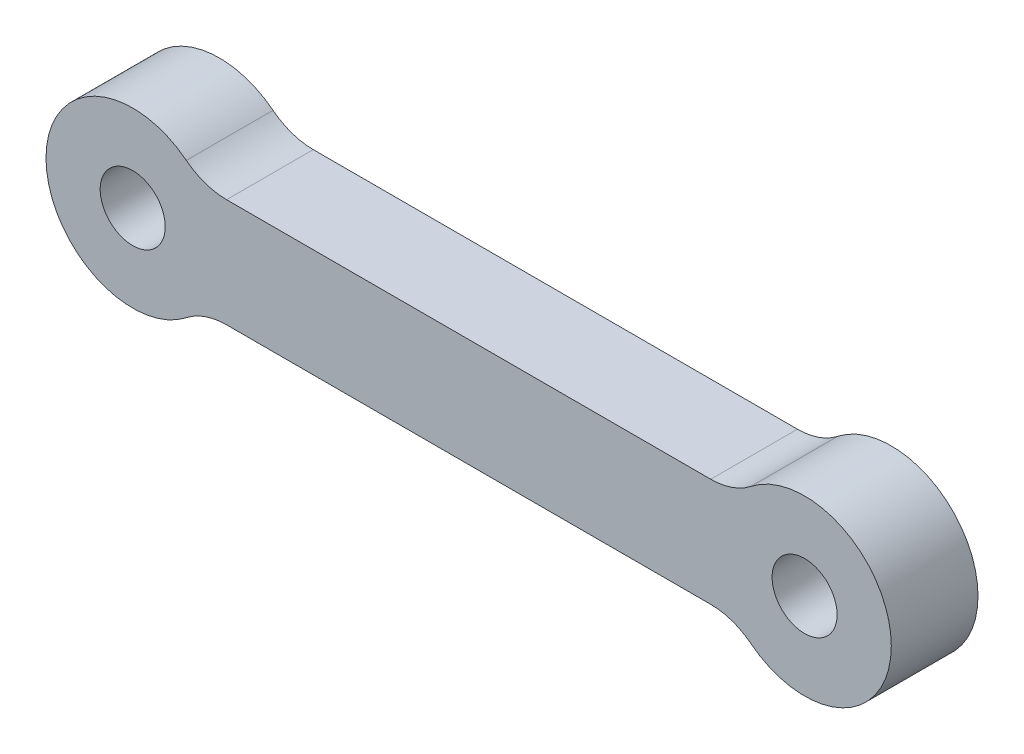
ISO-10303-21;
HEADER;
FILE_DESCRIPTION(('STEP AP214'),'2;1');
FILE_NAME('part.step','',(''),(''),'','','');
FILE_SCHEMA(('AUTOMOTIVE_DESIGN { 1 0 10303 214 1 1 1 1 }'));
ENDSEC;
DATA;
#1=APPLICATION_CONTEXT('core data for automotive mechanical design processes');
#2=APPLICATION_PROTOCOL_DEFINITION('international standard','automotive_design',2000,#1);
#3=PRODUCT_CONTEXT('',#1,'mechanical');
#4=PRODUCT('Part','Part','',(#3));
#5=PRODUCT_RELATED_PRODUCT_CATEGORY('part','',(#4));
#6=PRODUCT_DEFINITION_FORMATION('','',#4);
#7=PRODUCT_DEFINITION_CONTEXT('part definition',#1,'design');
#8=PRODUCT_DEFINITION('design','',#6,#7);
#9=PRODUCT_DEFINITION_SHAPE('','',#8);
#10=(LENGTH_UNIT() NAMED_UNIT(*) SI_UNIT(.MILLI.,.METRE.));
#11=(NAMED_UNIT(*) PLANE_ANGLE_UNIT() SI_UNIT($,.RADIAN.));
#12=(NAMED_UNIT(*) SI_UNIT($,.STERADIAN.) SOLID_ANGLE_UNIT());
#13=UNCERTAINTY_MEASURE_WITH_UNIT(LENGTH_MEASURE(1.E-05),#10,'distance_accuracy_value','');
#14=(GEOMETRIC_REPRESENTATION_CONTEXT(3) GLOBAL_UNCERTAINTY_ASSIGNED_CONTEXT((#13)) GLOBAL_UNIT_ASSIGNED_CONTEXT((#10,
#11,#12)) REPRESENTATION_CONTEXT('',''));
#15=CARTESIAN_POINT('',(0.,0.,0.));
#16=DIRECTION('',(0.,0.,1.));
#17=DIRECTION('',(1.,0.,0.));
#18=AXIS2_PLACEMENT_3D('',#15,#16,#17);
#19=CARTESIAN_POINT('',(11.1698729810778,5.5,4.));
#20=DIRECTION('',(0.,0.,-1.));
#21=DIRECTION('',(-1.,0.,0.));
#22=AXIS2_PLACEMENT_3D('',#19,#20,#21);
#23=CYLINDRICAL_SURFACE('',#22,3.);
#24=CARTESIAN_POINT('',(11.1698729810778,5.5,0.));
#25=DIRECTION('',(0.,0.,1.));
#26=DIRECTION('',(1.,0.,0.));
#27=AXIS2_PLACEMENT_3D('',#24,#25,#26);
#28=CIRCLE('',#27,3.);
#29=CARTESIAN_POINT('',(11.1698729810778,2.5,0.));
#30=VERTEX_POINT('',#29);
#31=CARTESIAN_POINT('',(13.025641703473,3.14285714285714,0.));
#32=VERTEX_POINT('',#31);
#33=EDGE_CURVE('E141',#30,#32,#28,.T.);
#34=ORIENTED_EDGE('',*,*,#33,.F.);
#35=DIRECTION('',(0.,0.,-1.));
#36=VECTOR('',#35,1.);
#37=CARTESIAN_POINT('',(11.1698729810778,2.5,4.));
#38=LINE('',#37,#36);
#39=CARTESIAN_POINT('',(11.1698729810778,2.5,4.));
#40=VERTEX_POINT('',#39);
#41=EDGE_CURVE('E11',#40,#30,#38,.T.);
#42=ORIENTED_EDGE('',*,*,#41,.F.);
#43=CARTESIAN_POINT('',(11.1698729810778,5.5,4.));
#44=DIRECTION('',(0.,0.,1.));
#45=DIRECTION('',(1.,0.,0.));
#46=AXIS2_PLACEMENT_3D('',#43,#44,#45);
#47=CIRCLE('',#46,3.);
#48=CARTESIAN_POINT('',(13.025641703473,3.14285714285714,4.));
#49=VERTEX_POINT('',#48);
#50=EDGE_CURVE('E163',#40,#49,#47,.T.);
#51=ORIENTED_EDGE('',*,*,#50,.T.);
#52=DIRECTION('',(0.,0.,-1.));
#53=VECTOR('',#52,1.);
#54=CARTESIAN_POINT('',(13.025641703473,3.14285714285714,4.));
#55=LINE('',#54,#53);
#56=EDGE_CURVE('E60',#49,#32,#55,.T.);
#57=ORIENTED_EDGE('',*,*,#56,.T.);
#58=EDGE_LOOP('',(#34,#42,#51,#57));
#59=FACE_BOUND('',#58,.T.);
#60=ADVANCED_FACE('F41',(#59),#23,.F.);
#61=CARTESIAN_POINT('',(0.,2.5,4.));
#62=DIRECTION('',(0.,1.,0.));
#63=DIRECTION('',(0.,0.,1.));
#64=AXIS2_PLACEMENT_3D('',#61,#62,#63);
#65=PLANE('',#64);
#66=DIRECTION('',(1.,0.,0.));
#67=VECTOR('',#66,1.);
#68=CARTESIAN_POINT('',(0.,2.5,0.));
#69=LINE('',#68,#67);
#70=CARTESIAN_POINT('',(-11.1698729810778,2.5,0.));
#71=VERTEX_POINT('',#70);
#72=EDGE_CURVE('E142',#71,#30,#69,.T.);
#73=ORIENTED_EDGE('',*,*,#72,.F.);
#74=DIRECTION('',(0.,0.,-1.));
#75=VECTOR('',#74,1.);
#76=CARTESIAN_POINT('',(-11.1698729810778,2.5,4.));
#77=LINE('',#76,#75);
#78=CARTESIAN_POINT('',(-11.1698729810778,2.5,4.));
#79=VERTEX_POINT('',#78);
#80=EDGE_CURVE('E47',#79,#71,#77,.T.);
#81=ORIENTED_EDGE('',*,*,#80,.F.);
#82=DIRECTION('',(1.,0.,0.));
#83=VECTOR('',#82,1.);
#84=CARTESIAN_POINT('',(0.,2.5,4.));
#85=LINE('',#84,#83);
#86=EDGE_CURVE('E188',#79,#40,#85,.T.);
#87=ORIENTED_EDGE('',*,*,#86,.T.);
#88=ORIENTED_EDGE('',*,*,#41,.T.);
#89=EDGE_LOOP('',(#73,#81,#87,#88));
#90=FACE_BOUND('',#89,.T.);
#91=ADVANCED_FACE('F187',(#90),#65,.T.);
#92=CARTESIAN_POINT('',(-11.1698729810778,5.5,4.));
#93=DIRECTION('',(0.,0.,-1.));
#94=DIRECTION('',(-1.,0.,0.));
#95=AXIS2_PLACEMENT_3D('',#92,#93,#94);
#96=CYLINDRICAL_SURFACE('',#95,3.);
#97=CARTESIAN_POINT('',(-11.1698729810778,5.5,0.));
#98=DIRECTION('',(0.,0.,1.));
#99=DIRECTION('',(1.,0.,0.));
#100=AXIS2_PLACEMENT_3D('',#97,#98,#99);
#101=CIRCLE('',#100,3.);
#102=CARTESIAN_POINT('',(-13.025641703473,3.14285714285714,0.));
#103=VERTEX_POINT('',#102);
#104=EDGE_CURVE('E147',#71,#103,#101,.F.);
#105=ORIENTED_EDGE('',*,*,#104,.T.);
#106=DIRECTION('',(0.,0.,-1.));
#107=VECTOR('',#106,1.);
#108=CARTESIAN_POINT('',(-13.025641703473,3.14285714285714,4.));
#109=LINE('',#108,#107);
#110=CARTESIAN_POINT('',(-13.025641703473,3.14285714285714,4.));
#111=VERTEX_POINT('',#110);
#112=EDGE_CURVE('E173',#111,#103,#109,.T.);
#113=ORIENTED_EDGE('',*,*,#112,.F.);
#114=CARTESIAN_POINT('',(-11.1698729810778,5.5,4.));
#115=DIRECTION('',(0.,0.,1.));
#116=DIRECTION('',(1.,0.,0.));
#117=AXIS2_PLACEMENT_3D('',#114,#115,#116);
#118=CIRCLE('',#117,3.);
#119=EDGE_CURVE('E178',#79,#111,#118,.F.);
#120=ORIENTED_EDGE('',*,*,#119,.F.);
#121=ORIENTED_EDGE('',*,*,#80,.T.);
#122=EDGE_LOOP('',(#105,#113,#120,#121));
#123=FACE_BOUND('',#122,.T.);
#124=ADVANCED_FACE('F176',(#123),#96,.F.);
#125=CARTESIAN_POINT('',(-15.5,0.,4.));
#126=DIRECTION('',(0.,0.,-1.));
#127=DIRECTION('',(-1.,0.,0.));
#128=AXIS2_PLACEMENT_3D('',#125,#126,#127);
#129=CYLINDRICAL_SURFACE('',#128,4.);
#130=CARTESIAN_POINT('',(-15.5,0.,0.));
#131=DIRECTION('',(0.,0.,1.));
#132=DIRECTION('',(1.,0.,0.));
#133=AXIS2_PLACEMENT_3D('',#130,#131,#132);
#134=CIRCLE('',#133,4.);
#135=CARTESIAN_POINT('',(-13.025641703473,-3.14285714285714,0.));
#136=VERTEX_POINT('',#135);
#137=EDGE_CURVE('E149',#103,#136,#134,.T.);
#138=ORIENTED_EDGE('',*,*,#137,.T.);
#139=DIRECTION('',(0.,0.,-1.));
#140=VECTOR('',#139,1.);
#141=CARTESIAN_POINT('',(-13.025641703473,-3.14285714285714,4.));
#142=LINE('',#141,#140);
#143=CARTESIAN_POINT('',(-13.025641703473,-3.14285714285714,4.));
#144=VERTEX_POINT('',#143);
#145=EDGE_CURVE('E166',#144,#136,#142,.T.);
#146=ORIENTED_EDGE('',*,*,#145,.F.);
#147=CARTESIAN_POINT('',(-15.5,0.,4.));
#148=DIRECTION('',(0.,0.,1.));
#149=DIRECTION('',(1.,0.,0.));
#150=AXIS2_PLACEMENT_3D('',#147,#148,#149);
#151=CIRCLE('',#150,4.);
#152=EDGE_CURVE('E293',#111,#144,#151,.T.);
#153=ORIENTED_EDGE('',*,*,#152,.F.);
#154=ORIENTED_EDGE('',*,*,#112,.T.);
#155=EDGE_LOOP('',(#138,#146,#153,#154));
#156=FACE_BOUND('',#155,.T.);
#157=ADVANCED_FACE('F213',(#156),#129,.T.);
#158=CARTESIAN_POINT('',(-11.1698729810778,-5.5,4.));
#159=DIRECTION('',(0.,0.,-1.));
#160=DIRECTION('',(-1.,0.,0.));
#161=AXIS2_PLACEMENT_3D('',#158,#159,#160);
#162=CYLINDRICAL_SURFACE('',#161,3.);
#163=CARTESIAN_POINT('',(-11.1698729810778,-5.5,0.));
#164=DIRECTION('',(0.,0.,1.));
#165=DIRECTION('',(1.,0.,0.));
#166=AXIS2_PLACEMENT_3D('',#163,#164,#165);
#167=CIRCLE('',#166,3.);
#168=CARTESIAN_POINT('',(-11.1698729810778,-2.5,0.));
#169=VERTEX_POINT('',#168);
#170=EDGE_CURVE('E148',#136,#169,#167,.F.);
#171=ORIENTED_EDGE('',*,*,#170,.T.);
#172=DIRECTION('',(0.,0.,-1.));
#173=VECTOR('',#172,1.);
#174=CARTESIAN_POINT('',(-11.1698729810778,-2.5,4.));
#175=LINE('',#174,#173);
#176=CARTESIAN_POINT('',(-11.1698729810778,-2.5,4.));
#177=VERTEX_POINT('',#176);
#178=EDGE_CURVE('E130',#177,#169,#175,.T.);
#179=ORIENTED_EDGE('',*,*,#178,.F.);
#180=CARTESIAN_POINT('',(-11.1698729810778,-5.5,4.));
#181=DIRECTION('',(0.,0.,1.));
#182=DIRECTION('',(1.,0.,0.));
#183=AXIS2_PLACEMENT_3D('',#180,#181,#182);
#184=CIRCLE('',#183,3.);
#185=EDGE_CURVE('E113',#144,#177,#184,.F.);
#186=ORIENTED_EDGE('',*,*,#185,.F.);
#187=ORIENTED_EDGE('',*,*,#145,.T.);
#188=EDGE_LOOP('',(#171,#179,#186,#187));
#189=FACE_BOUND('',#188,.T.);
#190=ADVANCED_FACE('F218',(#189),#162,.F.);
#191=CARTESIAN_POINT('',(0.,-2.5,4.));
#192=DIRECTION('',(0.,1.,0.));
#193=DIRECTION('',(0.,0.,1.));
#194=AXIS2_PLACEMENT_3D('',#191,#192,#193);
#195=PLANE('',#194);
#196=DIRECTION('',(1.,0.,0.));
#197=VECTOR('',#196,1.);
#198=CARTESIAN_POINT('',(0.,-2.5,0.));
#199=LINE('',#198,#197);
#200=CARTESIAN_POINT('',(11.1698729810778,-2.5,0.));
#201=VERTEX_POINT('',#200);
#202=EDGE_CURVE('E125',#169,#201,#199,.T.);
#203=ORIENTED_EDGE('',*,*,#202,.T.);
#204=DIRECTION('',(0.,0.,-1.));
#205=VECTOR('',#204,1.);
#206=CARTESIAN_POINT('',(11.1698729810778,-2.5,4.));
#207=LINE('',#206,#205);
#208=CARTESIAN_POINT('',(11.1698729810778,-2.5,4.));
#209=VERTEX_POINT('',#208);
#210=EDGE_CURVE('E123',#209,#201,#207,.T.);
#211=ORIENTED_EDGE('',*,*,#210,.F.);
#212=DIRECTION('',(1.,0.,0.));
#213=VECTOR('',#212,1.);
#214=CARTESIAN_POINT('',(0.,-2.5,4.));
#215=LINE('',#214,#213);
#216=EDGE_CURVE('E107',#177,#209,#215,.T.);
#217=ORIENTED_EDGE('',*,*,#216,.F.);
#218=ORIENTED_EDGE('',*,*,#178,.T.);
#219=EDGE_LOOP('',(#203,#211,#217,#218));
#220=FACE_BOUND('',#219,.T.);
#221=ADVANCED_FACE('F122',(#220),#195,.F.);
#222=CARTESIAN_POINT('',(11.1698729810778,-5.5,4.));
#223=DIRECTION('',(0.,0.,-1.));
#224=DIRECTION('',(-1.,0.,0.));
#225=AXIS2_PLACEMENT_3D('',#222,#223,#224);
#226=CYLINDRICAL_SURFACE('',#225,3.);
#227=CARTESIAN_POINT('',(11.1698729810778,-5.5,0.));
#228=DIRECTION('',(0.,0.,1.));
#229=DIRECTION('',(1.,0.,0.));
#230=AXIS2_PLACEMENT_3D('',#227,#228,#229);
#231=CIRCLE('',#230,3.);
#232=CARTESIAN_POINT('',(13.025641703473,-3.14285714285714,0.));
#233=VERTEX_POINT('',#232);
#234=EDGE_CURVE('E154',#201,#233,#231,.F.);
#235=ORIENTED_EDGE('',*,*,#234,.T.);
#236=DIRECTION('',(0.,0.,-1.));
#237=VECTOR('',#236,1.);
#238=CARTESIAN_POINT('',(13.025641703473,-3.14285714285714,4.));
#239=LINE('',#238,#237);
#240=CARTESIAN_POINT('',(13.025641703473,-3.14285714285714,4.));
#241=VERTEX_POINT('',#240);
#242=EDGE_CURVE('E81',#241,#233,#239,.T.);
#243=ORIENTED_EDGE('',*,*,#242,.F.);
#244=CARTESIAN_POINT('',(11.1698729810778,-5.5,4.));
#245=DIRECTION('',(0.,0.,1.));
#246=DIRECTION('',(1.,0.,0.));
#247=AXIS2_PLACEMENT_3D('',#244,#245,#246);
#248=CIRCLE('',#247,3.);
#249=EDGE_CURVE('E111',#209,#241,#248,.F.);
#250=ORIENTED_EDGE('',*,*,#249,.F.);
#251=ORIENTED_EDGE('',*,*,#210,.T.);
#252=EDGE_LOOP('',(#235,#243,#250,#251));
#253=FACE_BOUND('',#252,.T.);
#254=ADVANCED_FACE('F129',(#253),#226,.F.);
#255=CARTESIAN_POINT('',(15.5,0.,4.));
#256=DIRECTION('',(0.,0.,-1.));
#257=DIRECTION('',(-1.,0.,0.));
#258=AXIS2_PLACEMENT_3D('',#255,#256,#257);
#259=CYLINDRICAL_SURFACE('',#258,1.5);
#260=CARTESIAN_POINT('',(15.5,0.,4.));
#261=DIRECTION('',(0.,0.,1.));
#262=DIRECTION('',(1.,0.,0.));
#263=AXIS2_PLACEMENT_3D('',#260,#261,#262);
#264=CIRCLE('',#263,1.5);
#265=CARTESIAN_POINT('',(17.,0.,4.));
#266=VERTEX_POINT('',#265);
#267=EDGE_CURVE('E135',#266,#266,#264,.F.);
#268=ORIENTED_EDGE('',*,*,#267,.F.);
#269=EDGE_LOOP('',(#268));
#270=FACE_BOUND('',#269,.T.);
#271=CARTESIAN_POINT('',(15.5,0.,0.));
#272=DIRECTION('',(0.,0.,1.));
#273=DIRECTION('',(1.,0.,0.));
#274=AXIS2_PLACEMENT_3D('',#271,#272,#273);
#275=CIRCLE('',#274,1.5);
#276=CARTESIAN_POINT('',(17.,0.,0.));
#277=VERTEX_POINT('',#276);
#278=EDGE_CURVE('E156',#277,#277,#275,.F.);
#279=ORIENTED_EDGE('',*,*,#278,.T.);
#280=EDGE_LOOP('',(#279));
#281=FACE_BOUND('',#280,.T.);
#282=ADVANCED_FACE('F194',(#270,#281),#259,.F.);
#283=CARTESIAN_POINT('',(15.5,0.,4.));
#284=DIRECTION('',(0.,0.,-1.));
#285=DIRECTION('',(-1.,0.,0.));
#286=AXIS2_PLACEMENT_3D('',#283,#284,#285);
#287=CYLINDRICAL_SURFACE('',#286,4.);
#288=CARTESIAN_POINT('',(15.5,0.,0.));
#289=DIRECTION('',(0.,0.,1.));
#290=DIRECTION('',(1.,0.,0.));
#291=AXIS2_PLACEMENT_3D('',#288,#289,#290);
#292=CIRCLE('',#291,4.);
#293=EDGE_CURVE('E155',#32,#233,#292,.F.);
#294=ORIENTED_EDGE('',*,*,#293,.F.);
#295=ORIENTED_EDGE('',*,*,#56,.F.);
#296=CARTESIAN_POINT('',(15.5,0.,4.));
#297=DIRECTION('',(0.,0.,1.));
#298=DIRECTION('',(1.,0.,0.));
#299=AXIS2_PLACEMENT_3D('',#296,#297,#298);
#300=CIRCLE('',#299,4.);
#301=EDGE_CURVE('E127',#49,#241,#300,.F.);
#302=ORIENTED_EDGE('',*,*,#301,.T.);
#303=ORIENTED_EDGE('',*,*,#242,.T.);
#304=EDGE_LOOP('',(#294,#295,#302,#303));
#305=FACE_BOUND('',#304,.T.);
#306=ADVANCED_FACE('F189',(#305),#287,.T.);
#307=CARTESIAN_POINT('',(-15.5,0.,4.));
#308=DIRECTION('',(0.,0.,-1.));
#309=DIRECTION('',(-1.,0.,0.));
#310=AXIS2_PLACEMENT_3D('',#307,#308,#309);
#311=CYLINDRICAL_SURFACE('',#310,1.5);
#312=CARTESIAN_POINT('',(-15.5,0.,4.));
#313=DIRECTION('',(0.,0.,1.));
#314=DIRECTION('',(1.,0.,0.));
#315=AXIS2_PLACEMENT_3D('',#312,#313,#314);
#316=CIRCLE('',#315,1.5);
#317=CARTESIAN_POINT('',(-14.,0.,4.));
#318=VERTEX_POINT('',#317);
#319=EDGE_CURVE('E138',#318,#318,#316,.T.);
#320=ORIENTED_EDGE('',*,*,#319,.T.);
#321=EDGE_LOOP('',(#320));
#322=FACE_BOUND('',#321,.T.);
#323=CARTESIAN_POINT('',(-15.5,0.,0.));
#324=DIRECTION('',(0.,0.,1.));
#325=DIRECTION('',(1.,0.,0.));
#326=AXIS2_PLACEMENT_3D('',#323,#324,#325);
#327=CIRCLE('',#326,1.5);
#328=CARTESIAN_POINT('',(-14.,0.,0.));
#329=VERTEX_POINT('',#328);
#330=EDGE_CURVE('E161',#329,#329,#327,.T.);
#331=ORIENTED_EDGE('',*,*,#330,.F.);
#332=EDGE_LOOP('',(#331));
#333=FACE_BOUND('',#332,.T.);
#334=ADVANCED_FACE('F195',(#322,#333),#311,.F.);
#335=CARTESIAN_POINT('',(0.,0.,4.));
#336=DIRECTION('',(0.,0.,1.));
#337=DIRECTION('',(1.,0.,0.));
#338=AXIS2_PLACEMENT_3D('',#335,#336,#337);
#339=PLANE('',#338);
#340=ORIENTED_EDGE('',*,*,#50,.F.);
#341=ORIENTED_EDGE('',*,*,#86,.F.);
#342=ORIENTED_EDGE('',*,*,#119,.T.);
#343=ORIENTED_EDGE('',*,*,#152,.T.);
#344=ORIENTED_EDGE('',*,*,#185,.T.);
#345=ORIENTED_EDGE('',*,*,#216,.T.);
#346=ORIENTED_EDGE('',*,*,#249,.T.);
#347=ORIENTED_EDGE('',*,*,#301,.F.);
#348=EDGE_LOOP('',(#340,#341,#342,#343,#344,#345,#346,#347));
#349=FACE_BOUND('',#348,.T.);
#350=ORIENTED_EDGE('',*,*,#267,.T.);
#351=EDGE_LOOP('',(#350));
#352=FACE_BOUND('',#351,.T.);
#353=ORIENTED_EDGE('',*,*,#319,.F.);
#354=EDGE_LOOP('',(#353));
#355=FACE_BOUND('',#354,.T.);
#356=ADVANCED_FACE('F108',(#349,#352,#355),#339,.T.);
#357=CARTESIAN_POINT('',(0.,0.,0.));
#358=DIRECTION('',(0.,0.,1.));
#359=DIRECTION('',(1.,0.,0.));
#360=AXIS2_PLACEMENT_3D('',#357,#358,#359);
#361=PLANE('',#360);
#362=ORIENTED_EDGE('',*,*,#33,.T.);
#363=ORIENTED_EDGE('',*,*,#293,.T.);
#364=ORIENTED_EDGE('',*,*,#234,.F.);
#365=ORIENTED_EDGE('',*,*,#202,.F.);
#366=ORIENTED_EDGE('',*,*,#170,.F.);
#367=ORIENTED_EDGE('',*,*,#137,.F.);
#368=ORIENTED_EDGE('',*,*,#104,.F.);
#369=ORIENTED_EDGE('',*,*,#72,.T.);
#370=EDGE_LOOP('',(#362,#363,#364,#365,#366,#367,#368,#369));
#371=FACE_BOUND('',#370,.T.);
#372=ORIENTED_EDGE('',*,*,#278,.F.);
#373=EDGE_LOOP('',(#372));
#374=FACE_BOUND('',#373,.T.);
#375=ORIENTED_EDGE('',*,*,#330,.T.);
#376=EDGE_LOOP('',(#375));
#377=FACE_BOUND('',#376,.T.);
#378=ADVANCED_FACE('F184',(#371,#374,#377),#361,.F.);
#379=CLOSED_SHELL('',(#60,#91,#124,#157,#190,#221,#254,#282,#306,#334,#356,#378));
#380=MANIFOLD_SOLID_BREP('B2',#379);
#381=ADVANCED_BREP_SHAPE_REPRESENTATION('',(#18,#380),#14);
#382=SHAPE_DEFINITION_REPRESENTATION(#9,#381);
ENDSEC;
END-ISO-10303-21;
